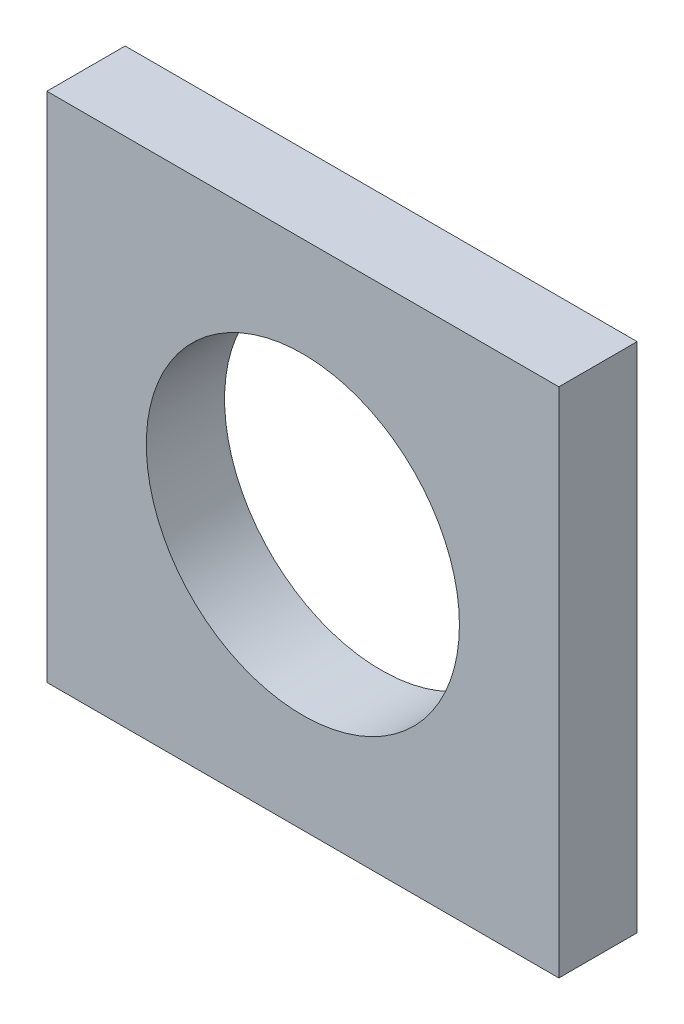
ISO-10303-21;
HEADER;
FILE_DESCRIPTION(('STEP AP214'),'2;1');
FILE_NAME('part.step','',(''),(''),'','','');
FILE_SCHEMA(('AUTOMOTIVE_DESIGN { 1 0 10303 214 1 1 1 1 }'));
ENDSEC;
DATA;
#1=APPLICATION_CONTEXT('core data for automotive mechanical design processes');
#2=APPLICATION_PROTOCOL_DEFINITION('international standard','automotive_design',2000,#1);
#3=PRODUCT_CONTEXT('',#1,'mechanical');
#4=PRODUCT('Part','Part','',(#3));
#5=PRODUCT_RELATED_PRODUCT_CATEGORY('part','',(#4));
#6=PRODUCT_DEFINITION_FORMATION('','',#4);
#7=PRODUCT_DEFINITION_CONTEXT('part definition',#1,'design');
#8=PRODUCT_DEFINITION('design','',#6,#7);
#9=PRODUCT_DEFINITION_SHAPE('','',#8);
#10=(LENGTH_UNIT() NAMED_UNIT(*) SI_UNIT(.MILLI.,.METRE.));
#11=(NAMED_UNIT(*) PLANE_ANGLE_UNIT() SI_UNIT($,.RADIAN.));
#12=(NAMED_UNIT(*) SI_UNIT($,.STERADIAN.) SOLID_ANGLE_UNIT());
#13=UNCERTAINTY_MEASURE_WITH_UNIT(LENGTH_MEASURE(1.E-05),#10,'distance_accuracy_value','');
#14=(GEOMETRIC_REPRESENTATION_CONTEXT(3) GLOBAL_UNCERTAINTY_ASSIGNED_CONTEXT((#13)) GLOBAL_UNIT_ASSIGNED_CONTEXT((#10,
#11,#12)) REPRESENTATION_CONTEXT('',''));
#15=CARTESIAN_POINT('',(0.,0.,0.));
#16=DIRECTION('',(0.,0.,1.));
#17=DIRECTION('',(1.,0.,0.));
#18=AXIS2_PLACEMENT_3D('',#15,#16,#17);
#19=CARTESIAN_POINT('',(113.176002502441,73.552001953125,0.));
#20=DIRECTION('',(0.,-1.,0.));
#21=DIRECTION('',(-1.,0.,0.));
#22=AXIS2_PLACEMENT_3D('',#19,#20,#21);
#23=PLANE('',#22);
#24=DIRECTION('',(-1.,0.,0.));
#25=VECTOR('',#24,1.);
#26=CARTESIAN_POINT('',(113.176002502441,73.552001953125,0.1999996));
#27=LINE('',#26,#25);
#28=CARTESIAN_POINT('',(113.176002502441,73.552001953125,0.1999996));
#29=VERTEX_POINT('',#28);
#30=CARTESIAN_POINT('',(111.86799621582,73.552001953125,0.1999996));
#31=VERTEX_POINT('',#30);
#32=EDGE_CURVE('E11',#29,#31,#27,.T.);
#33=ORIENTED_EDGE('',*,*,#32,.F.);
#34=DIRECTION('',(0.,0.,1.));
#35=VECTOR('',#34,1.);
#36=CARTESIAN_POINT('',(113.176002502441,73.552001953125,0.));
#37=LINE('',#36,#35);
#38=CARTESIAN_POINT('',(113.176002502441,73.552001953125,0.));
#39=VERTEX_POINT('',#38);
#40=EDGE_CURVE('E24',#39,#29,#37,.T.);
#41=ORIENTED_EDGE('',*,*,#40,.F.);
#42=DIRECTION('',(-1.,0.,0.));
#43=VECTOR('',#42,1.);
#44=CARTESIAN_POINT('',(113.176002502441,73.552001953125,0.));
#45=LINE('',#44,#43);
#46=CARTESIAN_POINT('',(111.86799621582,73.552001953125,0.));
#47=VERTEX_POINT('',#46);
#48=EDGE_CURVE('E96',#39,#47,#45,.T.);
#49=ORIENTED_EDGE('',*,*,#48,.T.);
#50=DIRECTION('',(0.,0.,1.));
#51=VECTOR('',#50,1.);
#52=CARTESIAN_POINT('',(111.86799621582,73.552001953125,0.));
#53=LINE('',#52,#51);
#54=EDGE_CURVE('E37',#47,#31,#53,.T.);
#55=ORIENTED_EDGE('',*,*,#54,.T.);
#56=EDGE_LOOP('',(#33,#41,#49,#55));
#57=FACE_BOUND('',#56,.T.);
#58=ADVANCED_FACE('F17',(#57),#23,.F.);
#59=CARTESIAN_POINT('',(111.86799621582,73.552001953125,0.));
#60=DIRECTION('',(1.,0.,0.));
#61=DIRECTION('',(0.,-1.,0.));
#62=AXIS2_PLACEMENT_3D('',#59,#60,#61);
#63=PLANE('',#62);
#64=DIRECTION('',(0.,-1.,0.));
#65=VECTOR('',#64,1.);
#66=CARTESIAN_POINT('',(111.86799621582,73.552001953125,0.1999996));
#67=LINE('',#66,#65);
#68=CARTESIAN_POINT('',(111.86799621582,72.2440032958984,0.1999996));
#69=VERTEX_POINT('',#68);
#70=EDGE_CURVE('E92',#31,#69,#67,.T.);
#71=ORIENTED_EDGE('',*,*,#70,.F.);
#72=ORIENTED_EDGE('',*,*,#54,.F.);
#73=DIRECTION('',(0.,-1.,0.));
#74=VECTOR('',#73,1.);
#75=CARTESIAN_POINT('',(111.86799621582,73.552001953125,0.));
#76=LINE('',#75,#74);
#77=CARTESIAN_POINT('',(111.86799621582,72.2440032958984,0.));
#78=VERTEX_POINT('',#77);
#79=EDGE_CURVE('E89',#47,#78,#76,.T.);
#80=ORIENTED_EDGE('',*,*,#79,.T.);
#81=DIRECTION('',(0.,0.,1.));
#82=VECTOR('',#81,1.);
#83=CARTESIAN_POINT('',(111.86799621582,72.2440032958984,0.));
#84=LINE('',#83,#82);
#85=EDGE_CURVE('E87',#78,#69,#84,.T.);
#86=ORIENTED_EDGE('',*,*,#85,.T.);
#87=EDGE_LOOP('',(#71,#72,#80,#86));
#88=FACE_BOUND('',#87,.T.);
#89=ADVANCED_FACE('F104',(#88),#63,.F.);
#90=CARTESIAN_POINT('',(111.86799621582,72.2440032958985,0.));
#91=DIRECTION('',(0.,1.,0.));
#92=DIRECTION('',(1.,0.,0.));
#93=AXIS2_PLACEMENT_3D('',#90,#91,#92);
#94=PLANE('',#93);
#95=DIRECTION('',(1.,0.,0.));
#96=VECTOR('',#95,1.);
#97=CARTESIAN_POINT('',(111.86799621582,72.2440032958984,0.1999996));
#98=LINE('',#97,#96);
#99=CARTESIAN_POINT('',(113.176002502441,72.2440032958984,0.1999996));
#100=VERTEX_POINT('',#99);
#101=EDGE_CURVE('E84',#69,#100,#98,.T.);
#102=ORIENTED_EDGE('',*,*,#101,.F.);
#103=ORIENTED_EDGE('',*,*,#85,.F.);
#104=DIRECTION('',(1.,0.,0.));
#105=VECTOR('',#104,1.);
#106=CARTESIAN_POINT('',(111.86799621582,72.2440032958984,0.));
#107=LINE('',#106,#105);
#108=CARTESIAN_POINT('',(113.176002502441,72.2440032958984,0.));
#109=VERTEX_POINT('',#108);
#110=EDGE_CURVE('E81',#78,#109,#107,.T.);
#111=ORIENTED_EDGE('',*,*,#110,.T.);
#112=DIRECTION('',(0.,0.,1.));
#113=VECTOR('',#112,1.);
#114=CARTESIAN_POINT('',(113.176002502441,72.2440032958984,0.));
#115=LINE('',#114,#113);
#116=EDGE_CURVE('E79',#109,#100,#115,.T.);
#117=ORIENTED_EDGE('',*,*,#116,.T.);
#118=EDGE_LOOP('',(#102,#103,#111,#117));
#119=FACE_BOUND('',#118,.T.);
#120=ADVANCED_FACE('F110',(#119),#94,.F.);
#121=CARTESIAN_POINT('',(113.176002502441,72.2440032958985,0.));
#122=DIRECTION('',(-1.,0.,0.));
#123=DIRECTION('',(0.,1.,0.));
#124=AXIS2_PLACEMENT_3D('',#121,#122,#123);
#125=PLANE('',#124);
#126=DIRECTION('',(0.,1.,0.));
#127=VECTOR('',#126,1.);
#128=CARTESIAN_POINT('',(113.176002502441,72.2440032958984,0.1999996));
#129=LINE('',#128,#127);
#130=EDGE_CURVE('E76',#100,#29,#129,.T.);
#131=ORIENTED_EDGE('',*,*,#130,.F.);
#132=ORIENTED_EDGE('',*,*,#116,.F.);
#133=DIRECTION('',(0.,1.,0.));
#134=VECTOR('',#133,1.);
#135=CARTESIAN_POINT('',(113.176002502441,72.2440032958984,0.));
#136=LINE('',#135,#134);
#137=EDGE_CURVE('E68',#109,#39,#136,.T.);
#138=ORIENTED_EDGE('',*,*,#137,.T.);
#139=ORIENTED_EDGE('',*,*,#40,.T.);
#140=EDGE_LOOP('',(#131,#132,#138,#139));
#141=FACE_BOUND('',#140,.T.);
#142=ADVANCED_FACE('F111',(#141),#125,.F.);
#143=CARTESIAN_POINT('',(112.522,72.898,0.));
#144=DIRECTION('',(0.,0.,-1.));
#145=DIRECTION('',(1.,0.,0.));
#146=AXIS2_PLACEMENT_3D('',#143,#144,#145);
#147=CYLINDRICAL_SURFACE('',#146,0.3999992);
#148=DIRECTION('',(0.,0.,1.));
#149=VECTOR('',#148,1.);
#150=CARTESIAN_POINT('',(112.9219992,72.898,0.));
#151=LINE('',#150,#149);
#152=CARTESIAN_POINT('',(112.9219992,72.898,0.));
#153=VERTEX_POINT('',#152);
#154=CARTESIAN_POINT('',(112.9219992,72.898,0.1999996));
#155=VERTEX_POINT('',#154);
#156=EDGE_CURVE('E62',#153,#155,#151,.T.);
#157=ORIENTED_EDGE('',*,*,#156,.T.);
#158=CARTESIAN_POINT('',(112.522,72.898,0.1999996));
#159=DIRECTION('',(0.,0.,1.));
#160=DIRECTION('',(1.,0.,0.));
#161=AXIS2_PLACEMENT_3D('',#158,#159,#160);
#162=CIRCLE('',#161,0.3999992);
#163=EDGE_CURVE('E67',#155,#155,#162,.T.);
#164=ORIENTED_EDGE('',*,*,#163,.T.);
#165=ORIENTED_EDGE('',*,*,#156,.F.);
#166=CARTESIAN_POINT('',(112.522,72.898,0.));
#167=DIRECTION('',(0.,0.,1.));
#168=DIRECTION('',(1.,0.,0.));
#169=AXIS2_PLACEMENT_3D('',#166,#167,#168);
#170=CIRCLE('',#169,0.3999992);
#171=EDGE_CURVE('E65',#153,#153,#170,.T.);
#172=ORIENTED_EDGE('',*,*,#171,.F.);
#173=EDGE_LOOP('',(#157,#164,#165,#172));
#174=FACE_BOUND('',#173,.T.);
#175=ADVANCED_FACE('F64',(#174),#147,.F.);
#176=CARTESIAN_POINT('',(113.176002502441,73.552001953125,0.));
#177=DIRECTION('',(0.,0.,-1.));
#178=DIRECTION('',(-1.,0.,0.));
#179=AXIS2_PLACEMENT_3D('',#176,#177,#178);
#180=PLANE('',#179);
#181=ORIENTED_EDGE('',*,*,#137,.F.);
#182=ORIENTED_EDGE('',*,*,#110,.F.);
#183=ORIENTED_EDGE('',*,*,#79,.F.);
#184=ORIENTED_EDGE('',*,*,#48,.F.);
#185=EDGE_LOOP('',(#181,#182,#183,#184));
#186=FACE_BOUND('',#185,.T.);
#187=ORIENTED_EDGE('',*,*,#171,.T.);
#188=EDGE_LOOP('',(#187));
#189=FACE_BOUND('',#188,.T.);
#190=ADVANCED_FACE('F71',(#186,#189),#180,.T.);
#191=CARTESIAN_POINT('',(113.176002502441,73.552001953125,0.1999996));
#192=DIRECTION('',(0.,0.,-1.));
#193=DIRECTION('',(-1.,0.,0.));
#194=AXIS2_PLACEMENT_3D('',#191,#192,#193);
#195=PLANE('',#194);
#196=ORIENTED_EDGE('',*,*,#32,.T.);
#197=ORIENTED_EDGE('',*,*,#70,.T.);
#198=ORIENTED_EDGE('',*,*,#101,.T.);
#199=ORIENTED_EDGE('',*,*,#130,.T.);
#200=EDGE_LOOP('',(#196,#197,#198,#199));
#201=FACE_BOUND('',#200,.T.);
#202=ORIENTED_EDGE('',*,*,#163,.F.);
#203=EDGE_LOOP('',(#202));
#204=FACE_BOUND('',#203,.T.);
#205=ADVANCED_FACE('F107',(#201,#204),#195,.F.);
#206=CLOSED_SHELL('',(#58,#89,#120,#142,#175,#190,#205));
#207=MANIFOLD_SOLID_BREP('B1',#206);
#208=ADVANCED_BREP_SHAPE_REPRESENTATION('',(#18,#207),#14);
#209=SHAPE_DEFINITION_REPRESENTATION(#9,#208);
ENDSEC;
END-ISO-10303-21;
